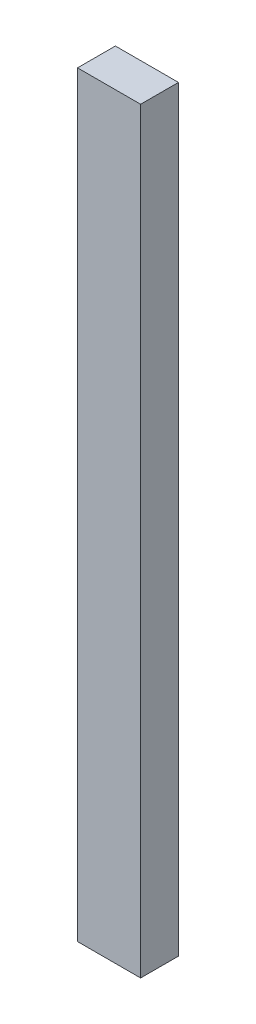
ISO-10303-21;
HEADER;
FILE_DESCRIPTION(('STEP AP214'),'2;1');
FILE_NAME('part.step','',(''),(''),'','','');
FILE_SCHEMA(('AUTOMOTIVE_DESIGN { 1 0 10303 214 1 1 1 1 }'));
ENDSEC;
DATA;
#1=APPLICATION_CONTEXT('core data for automotive mechanical design processes');
#2=APPLICATION_PROTOCOL_DEFINITION('international standard','automotive_design',2000,#1);
#3=PRODUCT_CONTEXT('',#1,'mechanical');
#4=PRODUCT('Part','Part','',(#3));
#5=PRODUCT_RELATED_PRODUCT_CATEGORY('part','',(#4));
#6=PRODUCT_DEFINITION_FORMATION('','',#4);
#7=PRODUCT_DEFINITION_CONTEXT('part definition',#1,'design');
#8=PRODUCT_DEFINITION('design','',#6,#7);
#9=PRODUCT_DEFINITION_SHAPE('','',#8);
#10=(LENGTH_UNIT() NAMED_UNIT(*) SI_UNIT(.MILLI.,.METRE.));
#11=(NAMED_UNIT(*) PLANE_ANGLE_UNIT() SI_UNIT($,.RADIAN.));
#12=(NAMED_UNIT(*) SI_UNIT($,.STERADIAN.) SOLID_ANGLE_UNIT());
#13=UNCERTAINTY_MEASURE_WITH_UNIT(LENGTH_MEASURE(1.E-05),#10,'distance_accuracy_value','');
#14=(GEOMETRIC_REPRESENTATION_CONTEXT(3) GLOBAL_UNCERTAINTY_ASSIGNED_CONTEXT((#13)) GLOBAL_UNIT_ASSIGNED_CONTEXT((#10,
#11,#12)) REPRESENTATION_CONTEXT('',''));
#15=CARTESIAN_POINT('',(0.,0.,0.));
#16=DIRECTION('',(0.,0.,1.));
#17=DIRECTION('',(1.,0.,0.));
#18=AXIS2_PLACEMENT_3D('',#15,#16,#17);
#19=CARTESIAN_POINT('',(3.39655500570993,0.,6.));
#20=DIRECTION('',(-1.,0.,0.));
#21=DIRECTION('',(0.,0.,1.));
#22=AXIS2_PLACEMENT_3D('',#19,#20,#21);
#23=PLANE('',#22);
#24=DIRECTION('',(0.,1.,0.));
#25=VECTOR('',#24,1.);
#26=CARTESIAN_POINT('',(3.39655500570993,0.,0.));
#27=LINE('',#26,#25);
#28=CARTESIAN_POINT('',(3.39655500570993,0.,0.));
#29=VERTEX_POINT('',#28);
#30=CARTESIAN_POINT('',(3.39655500570993,120.,0.));
#31=VERTEX_POINT('',#30);
#32=EDGE_CURVE('E107',#29,#31,#27,.T.);
#33=ORIENTED_EDGE('',*,*,#32,.T.);
#34=DIRECTION('',(0.,0.,-1.));
#35=VECTOR('',#34,1.);
#36=CARTESIAN_POINT('',(3.39655500570993,120.,6.));
#37=LINE('',#36,#35);
#38=CARTESIAN_POINT('',(3.39655500570993,120.,6.));
#39=VERTEX_POINT('',#38);
#40=EDGE_CURVE('E11',#39,#31,#37,.T.);
#41=ORIENTED_EDGE('',*,*,#40,.F.);
#42=DIRECTION('',(0.,1.,0.));
#43=VECTOR('',#42,1.);
#44=CARTESIAN_POINT('',(3.39655500570993,0.,6.));
#45=LINE('',#44,#43);
#46=CARTESIAN_POINT('',(3.39655500570993,0.,6.));
#47=VERTEX_POINT('',#46);
#48=EDGE_CURVE('E90',#47,#39,#45,.T.);
#49=ORIENTED_EDGE('',*,*,#48,.F.);
#50=DIRECTION('',(0.,0.,-1.));
#51=VECTOR('',#50,1.);
#52=CARTESIAN_POINT('',(3.39655500570993,0.,6.));
#53=LINE('',#52,#51);
#54=EDGE_CURVE('E103',#47,#29,#53,.T.);
#55=ORIENTED_EDGE('',*,*,#54,.T.);
#56=EDGE_LOOP('',(#33,#41,#49,#55));
#57=FACE_BOUND('',#56,.T.);
#58=ADVANCED_FACE('F38',(#57),#23,.F.);
#59=CARTESIAN_POINT('',(3.39655500570993,120.,6.));
#60=DIRECTION('',(0.,-1.,0.));
#61=DIRECTION('',(0.,0.,-1.));
#62=AXIS2_PLACEMENT_3D('',#59,#60,#61);
#63=PLANE('',#62);
#64=DIRECTION('',(-1.,0.,0.));
#65=VECTOR('',#64,1.);
#66=CARTESIAN_POINT('',(3.39655500570993,120.,0.));
#67=LINE('',#66,#65);
#68=CARTESIAN_POINT('',(-6.60344499429007,120.,0.));
#69=VERTEX_POINT('',#68);
#70=EDGE_CURVE('E95',#31,#69,#67,.T.);
#71=ORIENTED_EDGE('',*,*,#70,.T.);
#72=DIRECTION('',(0.,0.,-1.));
#73=VECTOR('',#72,1.);
#74=CARTESIAN_POINT('',(-6.60344499429007,120.,6.));
#75=LINE('',#74,#73);
#76=CARTESIAN_POINT('',(-6.60344499429007,120.,6.));
#77=VERTEX_POINT('',#76);
#78=EDGE_CURVE('E47',#77,#69,#75,.T.);
#79=ORIENTED_EDGE('',*,*,#78,.F.);
#80=DIRECTION('',(-1.,0.,0.));
#81=VECTOR('',#80,1.);
#82=CARTESIAN_POINT('',(3.39655500570993,120.,6.));
#83=LINE('',#82,#81);
#84=EDGE_CURVE('E85',#39,#77,#83,.T.);
#85=ORIENTED_EDGE('',*,*,#84,.F.);
#86=ORIENTED_EDGE('',*,*,#40,.T.);
#87=EDGE_LOOP('',(#71,#79,#85,#86));
#88=FACE_BOUND('',#87,.T.);
#89=ADVANCED_FACE('F94',(#88),#63,.F.);
#90=CARTESIAN_POINT('',(-6.60344499429007,0.,6.));
#91=DIRECTION('',(1.,0.,0.));
#92=DIRECTION('',(0.,0.,-1.));
#93=AXIS2_PLACEMENT_3D('',#90,#91,#92);
#94=PLANE('',#93);
#95=DIRECTION('',(0.,-1.,0.));
#96=VECTOR('',#95,1.);
#97=CARTESIAN_POINT('',(-6.60344499429007,0.,0.));
#98=LINE('',#97,#96);
#99=CARTESIAN_POINT('',(-6.60344499429007,0.,0.));
#100=VERTEX_POINT('',#99);
#101=EDGE_CURVE('E72',#69,#100,#98,.T.);
#102=ORIENTED_EDGE('',*,*,#101,.T.);
#103=DIRECTION('',(0.,0.,-1.));
#104=VECTOR('',#103,1.);
#105=CARTESIAN_POINT('',(-6.60344499429007,0.,6.));
#106=LINE('',#105,#104);
#107=CARTESIAN_POINT('',(-6.60344499429007,0.,6.));
#108=VERTEX_POINT('',#107);
#109=EDGE_CURVE('E97',#108,#100,#106,.T.);
#110=ORIENTED_EDGE('',*,*,#109,.F.);
#111=DIRECTION('',(0.,-1.,0.));
#112=VECTOR('',#111,1.);
#113=CARTESIAN_POINT('',(-6.60344499429007,0.,6.));
#114=LINE('',#113,#112);
#115=EDGE_CURVE('E88',#77,#108,#114,.T.);
#116=ORIENTED_EDGE('',*,*,#115,.F.);
#117=ORIENTED_EDGE('',*,*,#78,.T.);
#118=EDGE_LOOP('',(#102,#110,#116,#117));
#119=FACE_BOUND('',#118,.T.);
#120=ADVANCED_FACE('F98',(#119),#94,.F.);
#121=CARTESIAN_POINT('',(3.39655500570993,0.,6.));
#122=DIRECTION('',(0.,1.,0.));
#123=DIRECTION('',(-1.,0.,0.));
#124=AXIS2_PLACEMENT_3D('',#121,#122,#123);
#125=PLANE('',#124);
#126=DIRECTION('',(1.,0.,0.));
#127=VECTOR('',#126,1.);
#128=CARTESIAN_POINT('',(3.39655500570993,0.,0.));
#129=LINE('',#128,#127);
#130=EDGE_CURVE('E78',#100,#29,#129,.T.);
#131=ORIENTED_EDGE('',*,*,#130,.T.);
#132=ORIENTED_EDGE('',*,*,#54,.F.);
#133=DIRECTION('',(1.,0.,0.));
#134=VECTOR('',#133,1.);
#135=CARTESIAN_POINT('',(3.39655500570993,0.,6.));
#136=LINE('',#135,#134);
#137=EDGE_CURVE('E55',#108,#47,#136,.T.);
#138=ORIENTED_EDGE('',*,*,#137,.F.);
#139=ORIENTED_EDGE('',*,*,#109,.T.);
#140=EDGE_LOOP('',(#131,#132,#138,#139));
#141=FACE_BOUND('',#140,.T.);
#142=ADVANCED_FACE('F121',(#141),#125,.F.);
#143=CARTESIAN_POINT('',(0.,0.,6.));
#144=DIRECTION('',(0.,0.,1.));
#145=DIRECTION('',(1.,0.,0.));
#146=AXIS2_PLACEMENT_3D('',#143,#144,#145);
#147=PLANE('',#146);
#148=ORIENTED_EDGE('',*,*,#48,.T.);
#149=ORIENTED_EDGE('',*,*,#84,.T.);
#150=ORIENTED_EDGE('',*,*,#115,.T.);
#151=ORIENTED_EDGE('',*,*,#137,.T.);
#152=EDGE_LOOP('',(#148,#149,#150,#151));
#153=FACE_BOUND('',#152,.T.);
#154=ADVANCED_FACE('F86',(#153),#147,.T.);
#155=CARTESIAN_POINT('',(0.,0.,0.));
#156=DIRECTION('',(0.,0.,1.));
#157=DIRECTION('',(1.,0.,0.));
#158=AXIS2_PLACEMENT_3D('',#155,#156,#157);
#159=PLANE('',#158);
#160=ORIENTED_EDGE('',*,*,#32,.F.);
#161=ORIENTED_EDGE('',*,*,#130,.F.);
#162=ORIENTED_EDGE('',*,*,#101,.F.);
#163=ORIENTED_EDGE('',*,*,#70,.F.);
#164=EDGE_LOOP('',(#160,#161,#162,#163));
#165=FACE_BOUND('',#164,.T.);
#166=ADVANCED_FACE('F124',(#165),#159,.F.);
#167=CLOSED_SHELL('',(#58,#89,#120,#142,#154,#166));
#168=MANIFOLD_SOLID_BREP('B2',#167);
#169=ADVANCED_BREP_SHAPE_REPRESENTATION('',(#18,#168),#14);
#170=SHAPE_DEFINITION_REPRESENTATION(#9,#169);
ENDSEC;
END-ISO-10303-21;
